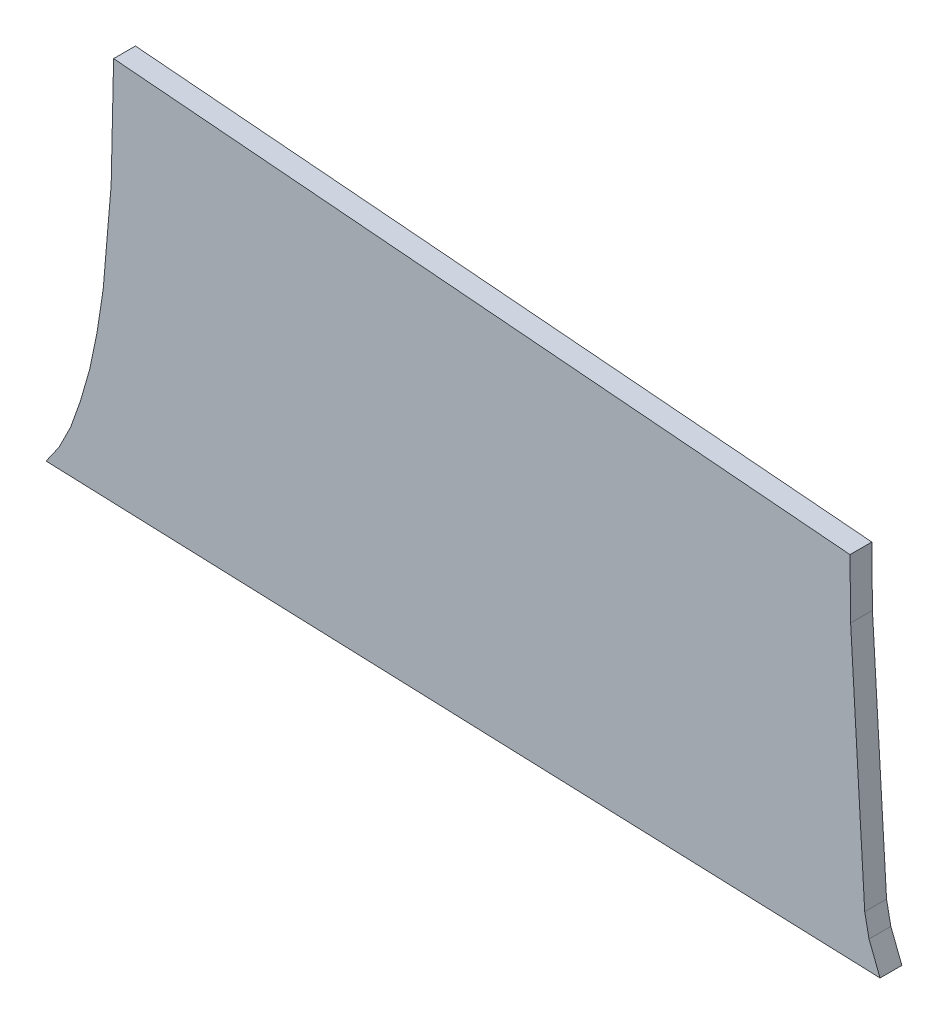
ISO-10303-21;
HEADER;
FILE_DESCRIPTION(('STEP AP214'),'2;1');
FILE_NAME('part.step','',(''),(''),'','','');
FILE_SCHEMA(('AUTOMOTIVE_DESIGN { 1 0 10303 214 1 1 1 1 }'));
ENDSEC;
DATA;
#1=APPLICATION_CONTEXT('core data for automotive mechanical design processes');
#2=APPLICATION_PROTOCOL_DEFINITION('international standard','automotive_design',2000,#1);
#3=PRODUCT_CONTEXT('',#1,'mechanical');
#4=PRODUCT('Part','Part','',(#3));
#5=PRODUCT_RELATED_PRODUCT_CATEGORY('part','',(#4));
#6=PRODUCT_DEFINITION_FORMATION('','',#4);
#7=PRODUCT_DEFINITION_CONTEXT('part definition',#1,'design');
#8=PRODUCT_DEFINITION('design','',#6,#7);
#9=PRODUCT_DEFINITION_SHAPE('','',#8);
#10=(LENGTH_UNIT() NAMED_UNIT(*) SI_UNIT(.MILLI.,.METRE.));
#11=(NAMED_UNIT(*) PLANE_ANGLE_UNIT() SI_UNIT($,.RADIAN.));
#12=(NAMED_UNIT(*) SI_UNIT($,.STERADIAN.) SOLID_ANGLE_UNIT());
#13=UNCERTAINTY_MEASURE_WITH_UNIT(LENGTH_MEASURE(1.E-05),#10,'distance_accuracy_value','');
#14=(GEOMETRIC_REPRESENTATION_CONTEXT(3) GLOBAL_UNCERTAINTY_ASSIGNED_CONTEXT((#13)) GLOBAL_UNIT_ASSIGNED_CONTEXT((#10,
#11,#12)) REPRESENTATION_CONTEXT('',''));
#15=CARTESIAN_POINT('',(0.,0.,0.));
#16=DIRECTION('',(0.,0.,1.));
#17=DIRECTION('',(1.,0.,0.));
#18=AXIS2_PLACEMENT_3D('',#15,#16,#17);
#19=CARTESIAN_POINT('',(66.2289962768555,89.197998046875,0.));
#20=DIRECTION('',(0.999756163969305,-0.0220819520283222,0.));
#21=DIRECTION('',(-0.0220819520283222,-0.999756163969305,0.));
#22=AXIS2_PLACEMENT_3D('',#19,#20,#21);
#23=PLANE('',#22);
#24=DIRECTION('',(-0.0220819520283222,-0.999756163969305,0.));
#25=VECTOR('',#24,1.);
#26=CARTESIAN_POINT('',(66.2289962768555,89.197998046875,0.03556));
#27=LINE('',#26,#25);
#28=CARTESIAN_POINT('',(66.2289962768555,89.197998046875,0.03556));
#29=VERTEX_POINT('',#28);
#30=CARTESIAN_POINT('',(66.2249984741211,89.0169982910156,0.03556));
#31=VERTEX_POINT('',#30);
#32=EDGE_CURVE('E11',#29,#31,#27,.T.);
#33=ORIENTED_EDGE('',*,*,#32,.F.);
#34=DIRECTION('',(0.,0.,1.));
#35=VECTOR('',#34,1.);
#36=CARTESIAN_POINT('',(66.2289962768555,89.197998046875,0.));
#37=LINE('',#36,#35);
#38=CARTESIAN_POINT('',(66.2289962768555,89.197998046875,0.));
#39=VERTEX_POINT('',#38);
#40=EDGE_CURVE('E24',#39,#29,#37,.T.);
#41=ORIENTED_EDGE('',*,*,#40,.F.);
#42=DIRECTION('',(-0.0220819520283222,-0.999756163969305,0.));
#43=VECTOR('',#42,1.);
#44=CARTESIAN_POINT('',(66.2289962768555,89.197998046875,0.));
#45=LINE('',#44,#43);
#46=CARTESIAN_POINT('',(66.2249984741211,89.0169982910156,0.));
#47=VERTEX_POINT('',#46);
#48=EDGE_CURVE('E136',#39,#47,#45,.T.);
#49=ORIENTED_EDGE('',*,*,#48,.T.);
#50=DIRECTION('',(0.,0.,1.));
#51=VECTOR('',#50,1.);
#52=CARTESIAN_POINT('',(66.2249984741211,89.0169982910156,0.));
#53=LINE('',#52,#51);
#54=EDGE_CURVE('E37',#47,#31,#53,.T.);
#55=ORIENTED_EDGE('',*,*,#54,.T.);
#56=EDGE_LOOP('',(#33,#41,#49,#55));
#57=FACE_BOUND('',#56,.T.);
#58=ADVANCED_FACE('F17',(#57),#23,.F.);
#59=CARTESIAN_POINT('',(66.2249984741211,89.0169982910156,0.));
#60=DIRECTION('',(0.996409431585345,-0.0846654867568279,0.));
#61=DIRECTION('',(-0.0846654867568279,-0.996409431585345,0.));
#62=AXIS2_PLACEMENT_3D('',#59,#60,#61);
#63=PLANE('',#62);
#64=DIRECTION('',(-0.0846654867568279,-0.996409431585345,0.));
#65=VECTOR('',#64,1.);
#66=CARTESIAN_POINT('',(66.2249984741211,89.0169982910156,0.03556));
#67=LINE('',#66,#65);
#68=CARTESIAN_POINT('',(66.2119979858398,88.8639984130859,0.03556));
#69=VERTEX_POINT('',#68);
#70=EDGE_CURVE('E224',#31,#69,#67,.T.);
#71=ORIENTED_EDGE('',*,*,#70,.F.);
#72=ORIENTED_EDGE('',*,*,#54,.F.);
#73=DIRECTION('',(-0.0846654867568279,-0.996409431585345,0.));
#74=VECTOR('',#73,1.);
#75=CARTESIAN_POINT('',(66.2249984741211,89.0169982910156,0.));
#76=LINE('',#75,#74);
#77=CARTESIAN_POINT('',(66.2119979858398,88.8639984130859,0.));
#78=VERTEX_POINT('',#77);
#79=EDGE_CURVE('E221',#47,#78,#76,.T.);
#80=ORIENTED_EDGE('',*,*,#79,.T.);
#81=DIRECTION('',(0.,0.,1.));
#82=VECTOR('',#81,1.);
#83=CARTESIAN_POINT('',(66.2119979858398,88.8639984130859,0.));
#84=LINE('',#83,#82);
#85=EDGE_CURVE('E219',#78,#69,#84,.T.);
#86=ORIENTED_EDGE('',*,*,#85,.T.);
#87=EDGE_LOOP('',(#71,#72,#80,#86));
#88=FACE_BOUND('',#87,.T.);
#89=ADVANCED_FACE('F232',(#88),#63,.F.);
#90=CARTESIAN_POINT('',(66.2119979858398,88.8639984130859,0.));
#91=DIRECTION('',(0.988728324955516,-0.149720738144923,0.));
#92=DIRECTION('',(-0.149720738144923,-0.988728324955516,0.));
#93=AXIS2_PLACEMENT_3D('',#90,#91,#92);
#94=PLANE('',#93);
#95=DIRECTION('',(-0.149720738144923,-0.988728324955516,0.));
#96=VECTOR('',#95,1.);
#97=CARTESIAN_POINT('',(66.2119979858398,88.8639984130859,0.03556));
#98=LINE('',#97,#96);
#99=CARTESIAN_POINT('',(66.2020034790039,88.7979965209961,0.03556));
#100=VERTEX_POINT('',#99);
#101=EDGE_CURVE('E216',#69,#100,#98,.T.);
#102=ORIENTED_EDGE('',*,*,#101,.F.);
#103=ORIENTED_EDGE('',*,*,#85,.F.);
#104=DIRECTION('',(-0.149720738144923,-0.988728324955516,0.));
#105=VECTOR('',#104,1.);
#106=CARTESIAN_POINT('',(66.2119979858398,88.8639984130859,0.));
#107=LINE('',#106,#105);
#108=CARTESIAN_POINT('',(66.2020034790039,88.7979965209961,0.));
#109=VERTEX_POINT('',#108);
#110=EDGE_CURVE('E213',#78,#109,#107,.T.);
#111=ORIENTED_EDGE('',*,*,#110,.T.);
#112=DIRECTION('',(0.,0.,1.));
#113=VECTOR('',#112,1.);
#114=CARTESIAN_POINT('',(66.2020034790039,88.7979965209961,0.));
#115=LINE('',#114,#113);
#116=EDGE_CURVE('E211',#109,#100,#115,.T.);
#117=ORIENTED_EDGE('',*,*,#116,.T.);
#118=EDGE_LOOP('',(#102,#103,#111,#117));
#119=FACE_BOUND('',#118,.T.);
#120=ADVANCED_FACE('F238',(#119),#94,.F.);
#121=CARTESIAN_POINT('',(66.2020034790039,88.7979965209961,0.));
#122=DIRECTION('',(0.97925601281336,-0.202626901888374,0.));
#123=DIRECTION('',(-0.202626901888374,-0.97925601281336,0.));
#124=AXIS2_PLACEMENT_3D('',#121,#122,#123);
#125=PLANE('',#124);
#126=DIRECTION('',(-0.202626901888374,-0.97925601281336,0.));
#127=VECTOR('',#126,1.);
#128=CARTESIAN_POINT('',(66.2020034790039,88.7979965209961,0.03556));
#129=LINE('',#128,#127);
#130=CARTESIAN_POINT('',(66.1900024414062,88.7399978637695,0.03556));
#131=VERTEX_POINT('',#130);
#132=EDGE_CURVE('E208',#100,#131,#129,.T.);
#133=ORIENTED_EDGE('',*,*,#132,.F.);
#134=ORIENTED_EDGE('',*,*,#116,.F.);
#135=DIRECTION('',(-0.202626901888374,-0.97925601281336,0.));
#136=VECTOR('',#135,1.);
#137=CARTESIAN_POINT('',(66.2020034790039,88.7979965209961,0.));
#138=LINE('',#137,#136);
#139=CARTESIAN_POINT('',(66.1900024414062,88.7399978637695,0.));
#140=VERTEX_POINT('',#139);
#141=EDGE_CURVE('E205',#109,#140,#138,.T.);
#142=ORIENTED_EDGE('',*,*,#141,.T.);
#143=DIRECTION('',(0.,0.,1.));
#144=VECTOR('',#143,1.);
#145=CARTESIAN_POINT('',(66.1900024414062,88.7399978637695,0.));
#146=LINE('',#145,#144);
#147=EDGE_CURVE('E203',#140,#131,#146,.T.);
#148=ORIENTED_EDGE('',*,*,#147,.T.);
#149=EDGE_LOOP('',(#133,#134,#142,#148));
#150=FACE_BOUND('',#149,.T.);
#151=ADVANCED_FACE('F240',(#150),#125,.F.);
#152=CARTESIAN_POINT('',(66.1900024414062,88.7399978637695,0.));
#153=DIRECTION('',(0.960818536902409,-0.277178172201047,0.));
#154=DIRECTION('',(-0.277178172201047,-0.960818536902409,0.));
#155=AXIS2_PLACEMENT_3D('',#152,#153,#154);
#156=PLANE('',#155);
#157=DIRECTION('',(-0.277178172201047,-0.960818536902409,0.));
#158=VECTOR('',#157,1.);
#159=CARTESIAN_POINT('',(66.1900024414062,88.7399978637695,0.03556));
#160=LINE('',#159,#158);
#161=CARTESIAN_POINT('',(66.1750030517578,88.6880035400391,0.03556));
#162=VERTEX_POINT('',#161);
#163=EDGE_CURVE('E200',#131,#162,#160,.T.);
#164=ORIENTED_EDGE('',*,*,#163,.F.);
#165=ORIENTED_EDGE('',*,*,#147,.F.);
#166=DIRECTION('',(-0.277178172201047,-0.960818536902409,0.));
#167=VECTOR('',#166,1.);
#168=CARTESIAN_POINT('',(66.1900024414062,88.7399978637695,0.));
#169=LINE('',#168,#167);
#170=CARTESIAN_POINT('',(66.1750030517578,88.6880035400391,0.));
#171=VERTEX_POINT('',#170);
#172=EDGE_CURVE('E197',#140,#171,#169,.T.);
#173=ORIENTED_EDGE('',*,*,#172,.T.);
#174=DIRECTION('',(0.,0.,1.));
#175=VECTOR('',#174,1.);
#176=CARTESIAN_POINT('',(66.1750030517578,88.6880035400391,0.));
#177=LINE('',#176,#175);
#178=EDGE_CURVE('E195',#171,#162,#177,.T.);
#179=ORIENTED_EDGE('',*,*,#178,.T.);
#180=EDGE_LOOP('',(#164,#165,#173,#179));
#181=FACE_BOUND('',#180,.T.);
#182=ADVANCED_FACE('F245',(#181),#156,.F.);
#183=CARTESIAN_POINT('',(66.1750030517578,88.6880035400391,0.));
#184=DIRECTION('',(0.942185557682797,-0.335091591798357,0.));
#185=DIRECTION('',(-0.335091591798357,-0.942185557682797,0.));
#186=AXIS2_PLACEMENT_3D('',#183,#184,#185);
#187=PLANE('',#186);
#188=DIRECTION('',(-0.335091591798357,-0.942185557682797,0.));
#189=VECTOR('',#188,1.);
#190=CARTESIAN_POINT('',(66.1750030517578,88.6880035400391,0.03556));
#191=LINE('',#190,#189);
#192=CARTESIAN_POINT('',(66.1589965820312,88.6429977416992,0.03556));
#193=VERTEX_POINT('',#192);
#194=EDGE_CURVE('E192',#162,#193,#191,.T.);
#195=ORIENTED_EDGE('',*,*,#194,.F.);
#196=ORIENTED_EDGE('',*,*,#178,.F.);
#197=DIRECTION('',(-0.335091591798357,-0.942185557682797,0.));
#198=VECTOR('',#197,1.);
#199=CARTESIAN_POINT('',(66.1750030517578,88.6880035400391,0.));
#200=LINE('',#199,#198);
#201=CARTESIAN_POINT('',(66.1589965820312,88.6429977416992,0.));
#202=VERTEX_POINT('',#201);
#203=EDGE_CURVE('E189',#171,#202,#200,.T.);
#204=ORIENTED_EDGE('',*,*,#203,.T.);
#205=DIRECTION('',(0.,0.,1.));
#206=VECTOR('',#205,1.);
#207=CARTESIAN_POINT('',(66.1589965820312,88.6429977416992,0.));
#208=LINE('',#207,#206);
#209=EDGE_CURVE('E187',#202,#193,#208,.T.);
#210=ORIENTED_EDGE('',*,*,#209,.T.);
#211=EDGE_LOOP('',(#195,#196,#204,#210));
#212=FACE_BOUND('',#211,.T.);
#213=ADVANCED_FACE('F248',(#212),#187,.F.);
#214=CARTESIAN_POINT('',(66.1589965820312,88.6429977416992,0.));
#215=DIRECTION('',(0.894427190999916,-0.447213595499958,0.));
#216=DIRECTION('',(-0.447213595499958,-0.894427190999916,0.));
#217=AXIS2_PLACEMENT_3D('',#214,#215,#216);
#218=PLANE('',#217);
#219=DIRECTION('',(-0.447213595499958,-0.894427190999916,0.));
#220=VECTOR('',#219,1.);
#221=CARTESIAN_POINT('',(66.1589965820312,88.6429977416992,0.03556));
#222=LINE('',#221,#220);
#223=CARTESIAN_POINT('',(66.1399993896484,88.6050033569336,0.03556));
#224=VERTEX_POINT('',#223);
#225=EDGE_CURVE('E184',#193,#224,#222,.T.);
#226=ORIENTED_EDGE('',*,*,#225,.F.);
#227=ORIENTED_EDGE('',*,*,#209,.F.);
#228=DIRECTION('',(-0.447213595499958,-0.894427190999916,0.));
#229=VECTOR('',#228,1.);
#230=CARTESIAN_POINT('',(66.1589965820312,88.6429977416992,0.));
#231=LINE('',#230,#229);
#232=CARTESIAN_POINT('',(66.1399993896484,88.6050033569336,0.));
#233=VERTEX_POINT('',#232);
#234=EDGE_CURVE('E181',#202,#233,#231,.T.);
#235=ORIENTED_EDGE('',*,*,#234,.T.);
#236=DIRECTION('',(0.,0.,1.));
#237=VECTOR('',#236,1.);
#238=CARTESIAN_POINT('',(66.1399993896484,88.6050033569336,0.));
#239=LINE('',#238,#237);
#240=EDGE_CURVE('E179',#233,#224,#239,.T.);
#241=ORIENTED_EDGE('',*,*,#240,.T.);
#242=EDGE_LOOP('',(#226,#227,#235,#241));
#243=FACE_BOUND('',#242,.T.);
#244=ADVANCED_FACE('F253',(#243),#218,.F.);
#245=CARTESIAN_POINT('',(66.1399993896484,88.6050033569336,0.));
#246=DIRECTION('',(0.819339563618952,-0.573308537777614,0.));
#247=DIRECTION('',(-0.573308537777614,-0.819339563618952,0.));
#248=AXIS2_PLACEMENT_3D('',#245,#246,#247);
#249=PLANE('',#248);
#250=DIRECTION('',(-0.573308537777614,-0.819339563618952,0.));
#251=VECTOR('',#250,1.);
#252=CARTESIAN_POINT('',(66.1399993896484,88.6050033569336,0.03556));
#253=LINE('',#252,#251);
#254=CARTESIAN_POINT('',(66.1190032958984,88.5749969482422,0.03556));
#255=VERTEX_POINT('',#254);
#256=EDGE_CURVE('E176',#224,#255,#253,.T.);
#257=ORIENTED_EDGE('',*,*,#256,.F.);
#258=ORIENTED_EDGE('',*,*,#240,.F.);
#259=DIRECTION('',(-0.573308537777614,-0.819339563618952,0.));
#260=VECTOR('',#259,1.);
#261=CARTESIAN_POINT('',(66.1399993896484,88.6050033569336,0.));
#262=LINE('',#261,#260);
#263=CARTESIAN_POINT('',(66.1190032958984,88.5749969482422,0.));
#264=VERTEX_POINT('',#263);
#265=EDGE_CURVE('E173',#233,#264,#262,.T.);
#266=ORIENTED_EDGE('',*,*,#265,.T.);
#267=DIRECTION('',(0.,0.,1.));
#268=VECTOR('',#267,1.);
#269=CARTESIAN_POINT('',(66.1190032958984,88.5749969482422,0.));
#270=LINE('',#269,#268);
#271=EDGE_CURVE('E171',#264,#255,#270,.T.);
#272=ORIENTED_EDGE('',*,*,#271,.T.);
#273=EDGE_LOOP('',(#257,#258,#266,#272));
#274=FACE_BOUND('',#273,.T.);
#275=ADVANCED_FACE('F256',(#274),#249,.F.);
#276=CARTESIAN_POINT('',(66.1190032958984,88.5749969482422,0.));
#277=DIRECTION('',(0.0367636958430739,0.999323986837081,0.));
#278=DIRECTION('',(0.999323986837081,-0.0367636958430739,0.));
#279=AXIS2_PLACEMENT_3D('',#276,#277,#278);
#280=PLANE('',#279);
#281=DIRECTION('',(0.999323986837081,-0.0367636958430739,0.));
#282=VECTOR('',#281,1.);
#283=CARTESIAN_POINT('',(66.1190032958984,88.5749969482422,0.03556));
#284=LINE('',#283,#282);
#285=CARTESIAN_POINT('',(67.4779968261719,88.5250015258789,0.03556));
#286=VERTEX_POINT('',#285);
#287=EDGE_CURVE('E168',#255,#286,#284,.T.);
#288=ORIENTED_EDGE('',*,*,#287,.F.);
#289=ORIENTED_EDGE('',*,*,#271,.F.);
#290=DIRECTION('',(0.999323986837081,-0.0367636958430739,0.));
#291=VECTOR('',#290,1.);
#292=CARTESIAN_POINT('',(66.1190032958984,88.5749969482422,0.));
#293=LINE('',#292,#291);
#294=CARTESIAN_POINT('',(67.4779968261719,88.5250015258789,0.));
#295=VERTEX_POINT('',#294);
#296=EDGE_CURVE('E165',#264,#295,#293,.T.);
#297=ORIENTED_EDGE('',*,*,#296,.T.);
#298=DIRECTION('',(0.,0.,1.));
#299=VECTOR('',#298,1.);
#300=CARTESIAN_POINT('',(67.4779968261719,88.5250015258789,0.));
#301=LINE('',#300,#299);
#302=EDGE_CURVE('E163',#295,#286,#301,.T.);
#303=ORIENTED_EDGE('',*,*,#302,.T.);
#304=EDGE_LOOP('',(#288,#289,#297,#303));
#305=FACE_BOUND('',#304,.T.);
#306=ADVANCED_FACE('F261',(#305),#280,.F.);
#307=CARTESIAN_POINT('',(67.4779968261719,88.5250015258789,0.));
#308=DIRECTION('',(-0.9312518952094,-0.364376052545857,0.));
#309=DIRECTION('',(-0.364376052545857,0.9312518952094,0.));
#310=AXIS2_PLACEMENT_3D('',#307,#308,#309);
#311=PLANE('',#310);
#312=DIRECTION('',(-0.364376052545857,0.9312518952094,0.));
#313=VECTOR('',#312,1.);
#314=CARTESIAN_POINT('',(67.4779968261719,88.5250015258789,0.03556));
#315=LINE('',#314,#313);
#316=CARTESIAN_POINT('',(67.4599990844727,88.5709991455078,0.03556));
#317=VERTEX_POINT('',#316);
#318=EDGE_CURVE('E160',#286,#317,#315,.T.);
#319=ORIENTED_EDGE('',*,*,#318,.F.);
#320=ORIENTED_EDGE('',*,*,#302,.F.);
#321=DIRECTION('',(-0.364376052545857,0.9312518952094,0.));
#322=VECTOR('',#321,1.);
#323=CARTESIAN_POINT('',(67.4779968261719,88.5250015258789,0.));
#324=LINE('',#323,#322);
#325=CARTESIAN_POINT('',(67.4599990844727,88.5709991455078,0.));
#326=VERTEX_POINT('',#325);
#327=EDGE_CURVE('E157',#295,#326,#324,.T.);
#328=ORIENTED_EDGE('',*,*,#327,.T.);
#329=DIRECTION('',(0.,0.,1.));
#330=VECTOR('',#329,1.);
#331=CARTESIAN_POINT('',(67.4599990844727,88.5709991455078,0.));
#332=LINE('',#331,#330);
#333=EDGE_CURVE('E155',#326,#317,#332,.T.);
#334=ORIENTED_EDGE('',*,*,#333,.T.);
#335=EDGE_LOOP('',(#319,#320,#328,#334));
#336=FACE_BOUND('',#335,.T.);
#337=ADVANCED_FACE('F264',(#336),#311,.F.);
#338=CARTESIAN_POINT('',(67.4599990844727,88.5709991455078,0.));
#339=DIRECTION('',(-0.980605329395905,-0.195992826298179,0.));
#340=DIRECTION('',(-0.195992826298179,0.980605329395905,0.));
#341=AXIS2_PLACEMENT_3D('',#338,#339,#340);
#342=PLANE('',#341);
#343=DIRECTION('',(-0.195992826298179,0.980605329395905,0.));
#344=VECTOR('',#343,1.);
#345=CARTESIAN_POINT('',(67.4599990844727,88.5709991455078,0.03556));
#346=LINE('',#345,#344);
#347=CARTESIAN_POINT('',(67.4530029296875,88.6060028076172,0.03556));
#348=VERTEX_POINT('',#347);
#349=EDGE_CURVE('E152',#317,#348,#346,.T.);
#350=ORIENTED_EDGE('',*,*,#349,.F.);
#351=ORIENTED_EDGE('',*,*,#333,.F.);
#352=DIRECTION('',(-0.195992826298179,0.980605329395905,0.));
#353=VECTOR('',#352,1.);
#354=CARTESIAN_POINT('',(67.4599990844727,88.5709991455078,0.));
#355=LINE('',#354,#353);
#356=CARTESIAN_POINT('',(67.4530029296875,88.6060028076172,0.));
#357=VERTEX_POINT('',#356);
#358=EDGE_CURVE('E149',#326,#357,#355,.T.);
#359=ORIENTED_EDGE('',*,*,#358,.T.);
#360=DIRECTION('',(0.,0.,1.));
#361=VECTOR('',#360,1.);
#362=CARTESIAN_POINT('',(67.4530029296875,88.6060028076172,0.));
#363=LINE('',#362,#361);
#364=EDGE_CURVE('E147',#357,#348,#363,.T.);
#365=ORIENTED_EDGE('',*,*,#364,.T.);
#366=EDGE_LOOP('',(#350,#351,#359,#365));
#367=FACE_BOUND('',#366,.T.);
#368=ADVANCED_FACE('F269',(#367),#342,.F.);
#369=CARTESIAN_POINT('',(67.4530029296875,88.6060028076172,0.));
#370=DIRECTION('',(-0.998317149158769,-0.0579902551771287,0.));
#371=DIRECTION('',(-0.0579902551771287,0.998317149158769,0.));
#372=AXIS2_PLACEMENT_3D('',#369,#370,#371);
#373=PLANE('',#372);
#374=DIRECTION('',(-0.0579902551771287,0.998317149158769,0.));
#375=VECTOR('',#374,1.);
#376=CARTESIAN_POINT('',(67.4530029296875,88.6060028076172,0.03556));
#377=LINE('',#376,#375);
#378=CARTESIAN_POINT('',(67.4300003051758,89.0019989013672,0.03556));
#379=VERTEX_POINT('',#378);
#380=EDGE_CURVE('E144',#348,#379,#377,.T.);
#381=ORIENTED_EDGE('',*,*,#380,.F.);
#382=ORIENTED_EDGE('',*,*,#364,.F.);
#383=DIRECTION('',(-0.0579902551771287,0.998317149158769,0.));
#384=VECTOR('',#383,1.);
#385=CARTESIAN_POINT('',(67.4530029296875,88.6060028076172,0.));
#386=LINE('',#385,#384);
#387=CARTESIAN_POINT('',(67.4300003051758,89.0019989013672,0.));
#388=VERTEX_POINT('',#387);
#389=EDGE_CURVE('E142',#357,#388,#386,.T.);
#390=ORIENTED_EDGE('',*,*,#389,.T.);
#391=DIRECTION('',(0.,0.,1.));
#392=VECTOR('',#391,1.);
#393=CARTESIAN_POINT('',(67.4300003051758,89.0019989013672,0.));
#394=LINE('',#393,#392);
#395=EDGE_CURVE('E127',#388,#379,#394,.T.);
#396=ORIENTED_EDGE('',*,*,#395,.T.);
#397=EDGE_LOOP('',(#381,#382,#390,#396));
#398=FACE_BOUND('',#397,.T.);
#399=ADVANCED_FACE('F271',(#398),#373,.F.);
#400=CARTESIAN_POINT('',(67.4300003051758,89.0019989013672,0.));
#401=DIRECTION('',(-0.99994581127901,-0.010410307659346,0.));
#402=DIRECTION('',(-0.010410307659346,0.99994581127901,0.));
#403=AXIS2_PLACEMENT_3D('',#400,#401,#402);
#404=PLANE('',#403);
#405=DIRECTION('',(-0.010410307659346,0.99994581127901,0.));
#406=VECTOR('',#405,1.);
#407=CARTESIAN_POINT('',(67.4300003051758,89.0019989013672,0.03556));
#408=LINE('',#407,#406);
#409=CARTESIAN_POINT('',(67.4290008544922,89.0979995727539,0.03556));
#410=VERTEX_POINT('',#409);
#411=EDGE_CURVE('E131',#379,#410,#408,.T.);
#412=ORIENTED_EDGE('',*,*,#411,.F.);
#413=ORIENTED_EDGE('',*,*,#395,.F.);
#414=DIRECTION('',(-0.010410307659346,0.99994581127901,0.));
#415=VECTOR('',#414,1.);
#416=CARTESIAN_POINT('',(67.4300003051758,89.0019989013672,0.));
#417=LINE('',#416,#415);
#418=CARTESIAN_POINT('',(67.4290008544922,89.0979995727539,0.));
#419=VERTEX_POINT('',#418);
#420=EDGE_CURVE('E123',#388,#419,#417,.T.);
#421=ORIENTED_EDGE('',*,*,#420,.T.);
#422=DIRECTION('',(0.,0.,1.));
#423=VECTOR('',#422,1.);
#424=CARTESIAN_POINT('',(67.4290008544922,89.0979995727539,0.));
#425=LINE('',#424,#423);
#426=EDGE_CURVE('E113',#419,#410,#425,.T.);
#427=ORIENTED_EDGE('',*,*,#426,.T.);
#428=EDGE_LOOP('',(#412,#413,#421,#427));
#429=FACE_BOUND('',#428,.T.);
#430=ADVANCED_FACE('F126',(#429),#404,.F.);
#431=CARTESIAN_POINT('',(67.4290008544922,89.0979995727539,0.));
#432=DIRECTION('',(-0.0830439068165148,-0.996545889330065,0.));
#433=DIRECTION('',(-0.996545889330065,0.0830439068165148,0.));
#434=AXIS2_PLACEMENT_3D('',#431,#432,#433);
#435=PLANE('',#434);
#436=DIRECTION('',(-0.996545889330065,0.0830439068165148,0.));
#437=VECTOR('',#436,1.);
#438=CARTESIAN_POINT('',(67.4290008544922,89.0979995727539,0.03556));
#439=LINE('',#438,#437);
#440=EDGE_CURVE('E119',#410,#29,#439,.T.);
#441=ORIENTED_EDGE('',*,*,#440,.F.);
#442=ORIENTED_EDGE('',*,*,#426,.F.);
#443=DIRECTION('',(-0.996545889330065,0.0830439068165148,0.));
#444=VECTOR('',#443,1.);
#445=CARTESIAN_POINT('',(67.4290008544922,89.0979995727539,0.));
#446=LINE('',#445,#444);
#447=EDGE_CURVE('E117',#419,#39,#446,.T.);
#448=ORIENTED_EDGE('',*,*,#447,.T.);
#449=ORIENTED_EDGE('',*,*,#40,.T.);
#450=EDGE_LOOP('',(#441,#442,#448,#449));
#451=FACE_BOUND('',#450,.T.);
#452=ADVANCED_FACE('F115',(#451),#435,.F.);
#453=CARTESIAN_POINT('',(66.2289962768555,89.197998046875,0.));
#454=DIRECTION('',(0.,0.,1.));
#455=DIRECTION('',(1.,0.,0.));
#456=AXIS2_PLACEMENT_3D('',#453,#454,#455);
#457=PLANE('',#456);
#458=ORIENTED_EDGE('',*,*,#447,.F.);
#459=ORIENTED_EDGE('',*,*,#420,.F.);
#460=ORIENTED_EDGE('',*,*,#389,.F.);
#461=ORIENTED_EDGE('',*,*,#358,.F.);
#462=ORIENTED_EDGE('',*,*,#327,.F.);
#463=ORIENTED_EDGE('',*,*,#296,.F.);
#464=ORIENTED_EDGE('',*,*,#265,.F.);
#465=ORIENTED_EDGE('',*,*,#234,.F.);
#466=ORIENTED_EDGE('',*,*,#203,.F.);
#467=ORIENTED_EDGE('',*,*,#172,.F.);
#468=ORIENTED_EDGE('',*,*,#141,.F.);
#469=ORIENTED_EDGE('',*,*,#110,.F.);
#470=ORIENTED_EDGE('',*,*,#79,.F.);
#471=ORIENTED_EDGE('',*,*,#48,.F.);
#472=EDGE_LOOP('',(#458,#459,#460,#461,#462,#463,#464,#465,#466,#467,#468,#469,#470,#471));
#473=FACE_BOUND('',#472,.T.);
#474=ADVANCED_FACE('F134',(#473),#457,.F.);
#475=CARTESIAN_POINT('',(66.2289962768555,89.197998046875,0.03556));
#476=DIRECTION('',(0.,0.,1.));
#477=DIRECTION('',(1.,0.,0.));
#478=AXIS2_PLACEMENT_3D('',#475,#476,#477);
#479=PLANE('',#478);
#480=ORIENTED_EDGE('',*,*,#32,.T.);
#481=ORIENTED_EDGE('',*,*,#70,.T.);
#482=ORIENTED_EDGE('',*,*,#101,.T.);
#483=ORIENTED_EDGE('',*,*,#132,.T.);
#484=ORIENTED_EDGE('',*,*,#163,.T.);
#485=ORIENTED_EDGE('',*,*,#194,.T.);
#486=ORIENTED_EDGE('',*,*,#225,.T.);
#487=ORIENTED_EDGE('',*,*,#256,.T.);
#488=ORIENTED_EDGE('',*,*,#287,.T.);
#489=ORIENTED_EDGE('',*,*,#318,.T.);
#490=ORIENTED_EDGE('',*,*,#349,.T.);
#491=ORIENTED_EDGE('',*,*,#380,.T.);
#492=ORIENTED_EDGE('',*,*,#411,.T.);
#493=ORIENTED_EDGE('',*,*,#440,.T.);
#494=EDGE_LOOP('',(#480,#481,#482,#483,#484,#485,#486,#487,#488,#489,#490,#491,#492,#493));
#495=FACE_BOUND('',#494,.T.);
#496=ADVANCED_FACE('F235',(#495),#479,.T.);
#497=CLOSED_SHELL('',(#58,#89,#120,#151,#182,#213,#244,#275,#306,#337,#368,#399,#430,#452,#474,#496));
#498=MANIFOLD_SOLID_BREP('B1',#497);
#499=ADVANCED_BREP_SHAPE_REPRESENTATION('',(#18,#498),#14);
#500=SHAPE_DEFINITION_REPRESENTATION(#9,#499);
ENDSEC;
END-ISO-10303-21;
